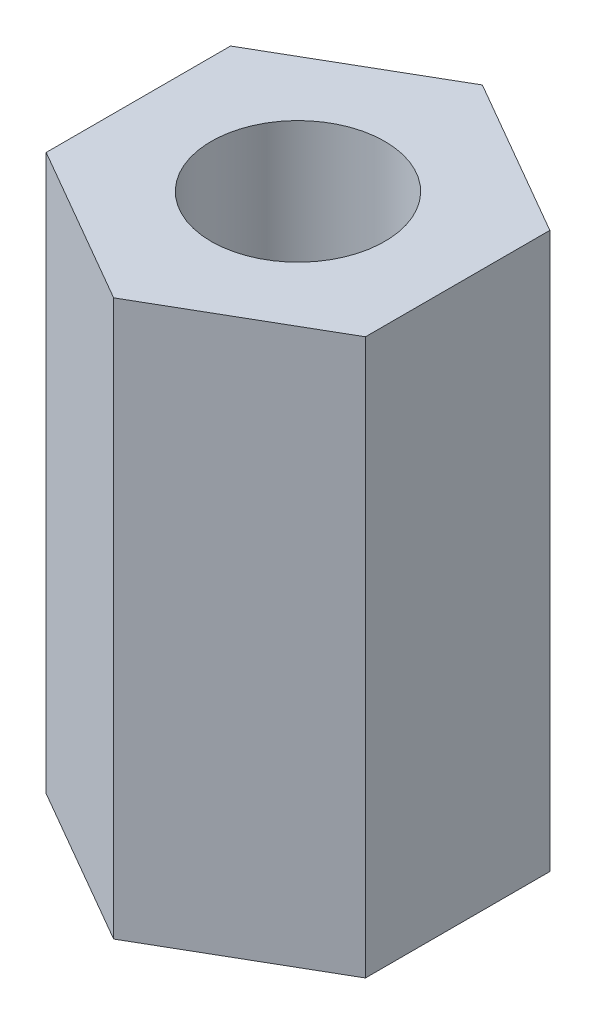
ISO-10303-21;
HEADER;
FILE_DESCRIPTION(('STEP AP214'),'2;1');
FILE_NAME('part.step','',(''),(''),'','','');
FILE_SCHEMA(('AUTOMOTIVE_DESIGN { 1 0 10303 214 1 1 1 1 }'));
ENDSEC;
DATA;
#1=APPLICATION_CONTEXT('core data for automotive mechanical design processes');
#2=APPLICATION_PROTOCOL_DEFINITION('international standard','automotive_design',2000,#1);
#3=PRODUCT_CONTEXT('',#1,'mechanical');
#4=PRODUCT('Part','Part','',(#3));
#5=PRODUCT_RELATED_PRODUCT_CATEGORY('part','',(#4));
#6=PRODUCT_DEFINITION_FORMATION('','',#4);
#7=PRODUCT_DEFINITION_CONTEXT('part definition',#1,'design');
#8=PRODUCT_DEFINITION('design','',#6,#7);
#9=PRODUCT_DEFINITION_SHAPE('','',#8);
#10=(LENGTH_UNIT() NAMED_UNIT(*) SI_UNIT(.MILLI.,.METRE.));
#11=(NAMED_UNIT(*) PLANE_ANGLE_UNIT() SI_UNIT($,.RADIAN.));
#12=(NAMED_UNIT(*) SI_UNIT($,.STERADIAN.) SOLID_ANGLE_UNIT());
#13=UNCERTAINTY_MEASURE_WITH_UNIT(LENGTH_MEASURE(1.E-05),#10,'distance_accuracy_value','');
#14=(GEOMETRIC_REPRESENTATION_CONTEXT(3) GLOBAL_UNCERTAINTY_ASSIGNED_CONTEXT((#13)) GLOBAL_UNIT_ASSIGNED_CONTEXT((#10,
#11,#12)) REPRESENTATION_CONTEXT('',''));
#15=CARTESIAN_POINT('',(0.,0.,0.));
#16=DIRECTION('',(0.,0.,1.));
#17=DIRECTION('',(1.,0.,0.));
#18=AXIS2_PLACEMENT_3D('',#15,#16,#17);
#19=CARTESIAN_POINT('',(0.,4.,2.65581123827228));
#20=DIRECTION('',(-0.5,0.,-0.866025403784439));
#21=DIRECTION('',(-0.866025403784439,0.,0.5));
#22=AXIS2_PLACEMENT_3D('',#19,#20,#21);
#23=PLANE('',#22);
#24=DIRECTION('',(0.866025403784439,0.,-0.5));
#25=VECTOR('',#24,1.);
#26=CARTESIAN_POINT('',(0.,-4.,2.65581123827228));
#27=LINE('',#26,#25);
#28=CARTESIAN_POINT('',(0.,-4.,2.65581123827228));
#29=VERTEX_POINT('',#28);
#30=CARTESIAN_POINT('',(2.3,-4.,1.32790561913614));
#31=VERTEX_POINT('',#30);
#32=EDGE_CURVE('E121',#29,#31,#27,.T.);
#33=ORIENTED_EDGE('',*,*,#32,.T.);
#34=DIRECTION('',(0.,-1.,0.));
#35=VECTOR('',#34,1.);
#36=CARTESIAN_POINT('',(2.3,4.,1.32790561913614));
#37=LINE('',#36,#35);
#38=CARTESIAN_POINT('',(2.3,4.,1.32790561913614));
#39=VERTEX_POINT('',#38);
#40=EDGE_CURVE('E11',#39,#31,#37,.T.);
#41=ORIENTED_EDGE('',*,*,#40,.F.);
#42=DIRECTION('',(0.866025403784439,0.,-0.5));
#43=VECTOR('',#42,1.);
#44=CARTESIAN_POINT('',(0.,4.,2.65581123827228));
#45=LINE('',#44,#43);
#46=CARTESIAN_POINT('',(0.,4.,2.65581123827228));
#47=VERTEX_POINT('',#46);
#48=EDGE_CURVE('E131',#47,#39,#45,.T.);
#49=ORIENTED_EDGE('',*,*,#48,.F.);
#50=DIRECTION('',(0.,-1.,0.));
#51=VECTOR('',#50,1.);
#52=CARTESIAN_POINT('',(0.,4.,2.65581123827228));
#53=LINE('',#52,#51);
#54=EDGE_CURVE('E117',#47,#29,#53,.T.);
#55=ORIENTED_EDGE('',*,*,#54,.T.);
#56=EDGE_LOOP('',(#33,#41,#49,#55));
#57=FACE_BOUND('',#56,.T.);
#58=ADVANCED_FACE('F36',(#57),#23,.F.);
#59=CARTESIAN_POINT('',(2.3,4.,1.32790561913614));
#60=DIRECTION('',(-1.,0.,0.));
#61=DIRECTION('',(0.,0.,1.));
#62=AXIS2_PLACEMENT_3D('',#59,#60,#61);
#63=PLANE('',#62);
#64=DIRECTION('',(0.,0.,-1.));
#65=VECTOR('',#64,1.);
#66=CARTESIAN_POINT('',(2.3,-4.,1.32790561913614));
#67=LINE('',#66,#65);
#68=CARTESIAN_POINT('',(2.29999999999999,-4.,-1.32790561913614));
#69=VERTEX_POINT('',#68);
#70=EDGE_CURVE('E124',#31,#69,#67,.T.);
#71=ORIENTED_EDGE('',*,*,#70,.T.);
#72=DIRECTION('',(0.,-1.,0.));
#73=VECTOR('',#72,1.);
#74=CARTESIAN_POINT('',(2.29999999999999,4.,-1.32790561913614));
#75=LINE('',#74,#73);
#76=CARTESIAN_POINT('',(2.29999999999999,4.,-1.32790561913614));
#77=VERTEX_POINT('',#76);
#78=EDGE_CURVE('E45',#77,#69,#75,.T.);
#79=ORIENTED_EDGE('',*,*,#78,.F.);
#80=DIRECTION('',(0.,0.,-1.));
#81=VECTOR('',#80,1.);
#82=CARTESIAN_POINT('',(2.3,4.,1.32790561913614));
#83=LINE('',#82,#81);
#84=EDGE_CURVE('E90',#39,#77,#83,.T.);
#85=ORIENTED_EDGE('',*,*,#84,.F.);
#86=ORIENTED_EDGE('',*,*,#40,.T.);
#87=EDGE_LOOP('',(#71,#79,#85,#86));
#88=FACE_BOUND('',#87,.T.);
#89=ADVANCED_FACE('F157',(#88),#63,.F.);
#90=CARTESIAN_POINT('',(2.29999999999999,4.,-1.32790561913614));
#91=DIRECTION('',(-0.5,0.,0.866025403784439));
#92=DIRECTION('',(0.866025403784439,0.,0.5));
#93=AXIS2_PLACEMENT_3D('',#90,#91,#92);
#94=PLANE('',#93);
#95=DIRECTION('',(-0.866025403784439,0.,-0.5));
#96=VECTOR('',#95,1.);
#97=CARTESIAN_POINT('',(2.29999999999999,-4.,-1.32790561913614));
#98=LINE('',#97,#96);
#99=CARTESIAN_POINT('',(0.,-4.,-2.65581123827228));
#100=VERTEX_POINT('',#99);
#101=EDGE_CURVE('E126',#69,#100,#98,.T.);
#102=ORIENTED_EDGE('',*,*,#101,.T.);
#103=DIRECTION('',(0.,-1.,0.));
#104=VECTOR('',#103,1.);
#105=CARTESIAN_POINT('',(0.,4.,-2.65581123827228));
#106=LINE('',#105,#104);
#107=CARTESIAN_POINT('',(0.,4.,-2.65581123827228));
#108=VERTEX_POINT('',#107);
#109=EDGE_CURVE('E112',#108,#100,#106,.T.);
#110=ORIENTED_EDGE('',*,*,#109,.F.);
#111=DIRECTION('',(-0.866025403784439,0.,-0.5));
#112=VECTOR('',#111,1.);
#113=CARTESIAN_POINT('',(2.29999999999999,4.,-1.32790561913614));
#114=LINE('',#113,#112);
#115=EDGE_CURVE('E103',#77,#108,#114,.T.);
#116=ORIENTED_EDGE('',*,*,#115,.F.);
#117=ORIENTED_EDGE('',*,*,#78,.T.);
#118=EDGE_LOOP('',(#102,#110,#116,#117));
#119=FACE_BOUND('',#118,.T.);
#120=ADVANCED_FACE('F138',(#119),#94,.F.);
#121=CARTESIAN_POINT('',(0.,4.,-2.65581123827228));
#122=DIRECTION('',(0.5,0.,0.866025403784439));
#123=DIRECTION('',(0.866025403784439,0.,-0.5));
#124=AXIS2_PLACEMENT_3D('',#121,#122,#123);
#125=PLANE('',#124);
#126=DIRECTION('',(-0.866025403784439,0.,0.5));
#127=VECTOR('',#126,1.);
#128=CARTESIAN_POINT('',(0.,-4.,-2.65581123827228));
#129=LINE('',#128,#127);
#130=CARTESIAN_POINT('',(-2.3,-4.,-1.32790561913614));
#131=VERTEX_POINT('',#130);
#132=EDGE_CURVE('E111',#100,#131,#129,.T.);
#133=ORIENTED_EDGE('',*,*,#132,.T.);
#134=DIRECTION('',(0.,-1.,0.));
#135=VECTOR('',#134,1.);
#136=CARTESIAN_POINT('',(-2.3,4.,-1.32790561913614));
#137=LINE('',#136,#135);
#138=CARTESIAN_POINT('',(-2.3,4.,-1.32790561913614));
#139=VERTEX_POINT('',#138);
#140=EDGE_CURVE('E108',#139,#131,#137,.T.);
#141=ORIENTED_EDGE('',*,*,#140,.F.);
#142=DIRECTION('',(-0.866025403784439,0.,0.5));
#143=VECTOR('',#142,1.);
#144=CARTESIAN_POINT('',(0.,4.,-2.65581123827228));
#145=LINE('',#144,#143);
#146=EDGE_CURVE('E97',#108,#139,#145,.T.);
#147=ORIENTED_EDGE('',*,*,#146,.F.);
#148=ORIENTED_EDGE('',*,*,#109,.T.);
#149=EDGE_LOOP('',(#133,#141,#147,#148));
#150=FACE_BOUND('',#149,.T.);
#151=ADVANCED_FACE('F109',(#150),#125,.F.);
#152=CARTESIAN_POINT('',(-2.3,4.,-1.32790561913614));
#153=DIRECTION('',(1.,0.,0.));
#154=DIRECTION('',(0.,0.,-1.));
#155=AXIS2_PLACEMENT_3D('',#152,#153,#154);
#156=PLANE('',#155);
#157=DIRECTION('',(0.,0.,1.));
#158=VECTOR('',#157,1.);
#159=CARTESIAN_POINT('',(-2.3,-4.,-1.32790561913614));
#160=LINE('',#159,#158);
#161=CARTESIAN_POINT('',(-2.3,-4.,1.32790561913614));
#162=VERTEX_POINT('',#161);
#163=EDGE_CURVE('E76',#131,#162,#160,.T.);
#164=ORIENTED_EDGE('',*,*,#163,.T.);
#165=DIRECTION('',(0.,-1.,0.));
#166=VECTOR('',#165,1.);
#167=CARTESIAN_POINT('',(-2.3,4.,1.32790561913614));
#168=LINE('',#167,#166);
#169=CARTESIAN_POINT('',(-2.3,4.,1.32790561913614));
#170=VERTEX_POINT('',#169);
#171=EDGE_CURVE('E113',#170,#162,#168,.T.);
#172=ORIENTED_EDGE('',*,*,#171,.F.);
#173=DIRECTION('',(0.,0.,1.));
#174=VECTOR('',#173,1.);
#175=CARTESIAN_POINT('',(-2.3,4.,-1.32790561913614));
#176=LINE('',#175,#174);
#177=EDGE_CURVE('E101',#139,#170,#176,.T.);
#178=ORIENTED_EDGE('',*,*,#177,.F.);
#179=ORIENTED_EDGE('',*,*,#140,.T.);
#180=EDGE_LOOP('',(#164,#172,#178,#179));
#181=FACE_BOUND('',#180,.T.);
#182=ADVANCED_FACE('F115',(#181),#156,.F.);
#183=CARTESIAN_POINT('',(-2.3,4.,1.32790561913614));
#184=DIRECTION('',(0.500000000000001,0.,-0.866025403784438));
#185=DIRECTION('',(-0.866025403784438,0.,-0.500000000000001));
#186=AXIS2_PLACEMENT_3D('',#183,#184,#185);
#187=PLANE('',#186);
#188=DIRECTION('',(0.866025403784438,0.,0.500000000000001));
#189=VECTOR('',#188,1.);
#190=CARTESIAN_POINT('',(-2.3,-4.,1.32790561913614));
#191=LINE('',#190,#189);
#192=EDGE_CURVE('E82',#162,#29,#191,.T.);
#193=ORIENTED_EDGE('',*,*,#192,.T.);
#194=ORIENTED_EDGE('',*,*,#54,.F.);
#195=DIRECTION('',(0.866025403784438,0.,0.500000000000001));
#196=VECTOR('',#195,1.);
#197=CARTESIAN_POINT('',(-2.3,4.,1.32790561913614));
#198=LINE('',#197,#196);
#199=EDGE_CURVE('E53',#170,#47,#198,.T.);
#200=ORIENTED_EDGE('',*,*,#199,.F.);
#201=ORIENTED_EDGE('',*,*,#171,.T.);
#202=EDGE_LOOP('',(#193,#194,#200,#201));
#203=FACE_BOUND('',#202,.T.);
#204=ADVANCED_FACE('F145',(#203),#187,.F.);
#205=CARTESIAN_POINT('',(0.,4.,0.));
#206=DIRECTION('',(0.,1.,0.));
#207=DIRECTION('',(0.,0.,1.));
#208=AXIS2_PLACEMENT_3D('',#205,#206,#207);
#209=PLANE('',#208);
#210=CARTESIAN_POINT('',(0.,4.,0.));
#211=DIRECTION('',(0.,1.,0.));
#212=DIRECTION('',(0.,0.,1.));
#213=AXIS2_PLACEMENT_3D('',#210,#211,#212);
#214=CIRCLE('',#213,1.24999999999999);
#215=CARTESIAN_POINT('',(0.,4.,1.24999999999999));
#216=VERTEX_POINT('',#215);
#217=EDGE_CURVE('E214',#216,#216,#214,.T.);
#218=ORIENTED_EDGE('',*,*,#217,.F.);
#219=EDGE_LOOP('',(#218));
#220=FACE_BOUND('',#219,.T.);
#221=ORIENTED_EDGE('',*,*,#48,.T.);
#222=ORIENTED_EDGE('',*,*,#84,.T.);
#223=ORIENTED_EDGE('',*,*,#115,.T.);
#224=ORIENTED_EDGE('',*,*,#146,.T.);
#225=ORIENTED_EDGE('',*,*,#177,.T.);
#226=ORIENTED_EDGE('',*,*,#199,.T.);
#227=EDGE_LOOP('',(#221,#222,#223,#224,#225,#226));
#228=FACE_BOUND('',#227,.T.);
#229=ADVANCED_FACE('F99',(#220,#228),#209,.T.);
#230=CARTESIAN_POINT('',(0.,-4.,0.));
#231=DIRECTION('',(0.,1.,0.));
#232=DIRECTION('',(0.,0.,1.));
#233=AXIS2_PLACEMENT_3D('',#230,#231,#232);
#234=PLANE('',#233);
#235=CARTESIAN_POINT('',(0.,-4.,0.));
#236=DIRECTION('',(0.,1.,0.));
#237=DIRECTION('',(0.,0.,1.));
#238=AXIS2_PLACEMENT_3D('',#235,#236,#237);
#239=CIRCLE('',#238,1.24999999999999);
#240=CARTESIAN_POINT('',(0.,-4.,1.24999999999999));
#241=VERTEX_POINT('',#240);
#242=EDGE_CURVE('E39',#241,#241,#239,.T.);
#243=ORIENTED_EDGE('',*,*,#242,.T.);
#244=EDGE_LOOP('',(#243));
#245=FACE_BOUND('',#244,.T.);
#246=ORIENTED_EDGE('',*,*,#32,.F.);
#247=ORIENTED_EDGE('',*,*,#192,.F.);
#248=ORIENTED_EDGE('',*,*,#163,.F.);
#249=ORIENTED_EDGE('',*,*,#132,.F.);
#250=ORIENTED_EDGE('',*,*,#101,.F.);
#251=ORIENTED_EDGE('',*,*,#70,.F.);
#252=EDGE_LOOP('',(#246,#247,#248,#249,#250,#251));
#253=FACE_BOUND('',#252,.T.);
#254=ADVANCED_FACE('F141',(#245,#253),#234,.F.);
#255=CARTESIAN_POINT('',(0.,4.,0.));
#256=DIRECTION('',(0.,1.,0.));
#257=DIRECTION('',(0.,0.,1.));
#258=AXIS2_PLACEMENT_3D('',#255,#256,#257);
#259=CYLINDRICAL_SURFACE('',#258,1.24999999999999);
#260=ORIENTED_EDGE('',*,*,#217,.T.);
#261=EDGE_LOOP('',(#260));
#262=FACE_BOUND('',#261,.T.);
#263=ORIENTED_EDGE('',*,*,#242,.F.);
#264=EDGE_LOOP('',(#263));
#265=FACE_BOUND('',#264,.T.);
#266=ADVANCED_FACE('F194',(#262,#265),#259,.F.);
#267=CLOSED_SHELL('',(#58,#89,#120,#151,#182,#204,#229,#254,#266));
#268=MANIFOLD_SOLID_BREP('B2',#267);
#269=ADVANCED_BREP_SHAPE_REPRESENTATION('',(#18,#268),#14);
#270=SHAPE_DEFINITION_REPRESENTATION(#9,#269);
ENDSEC;
END-ISO-10303-21;
